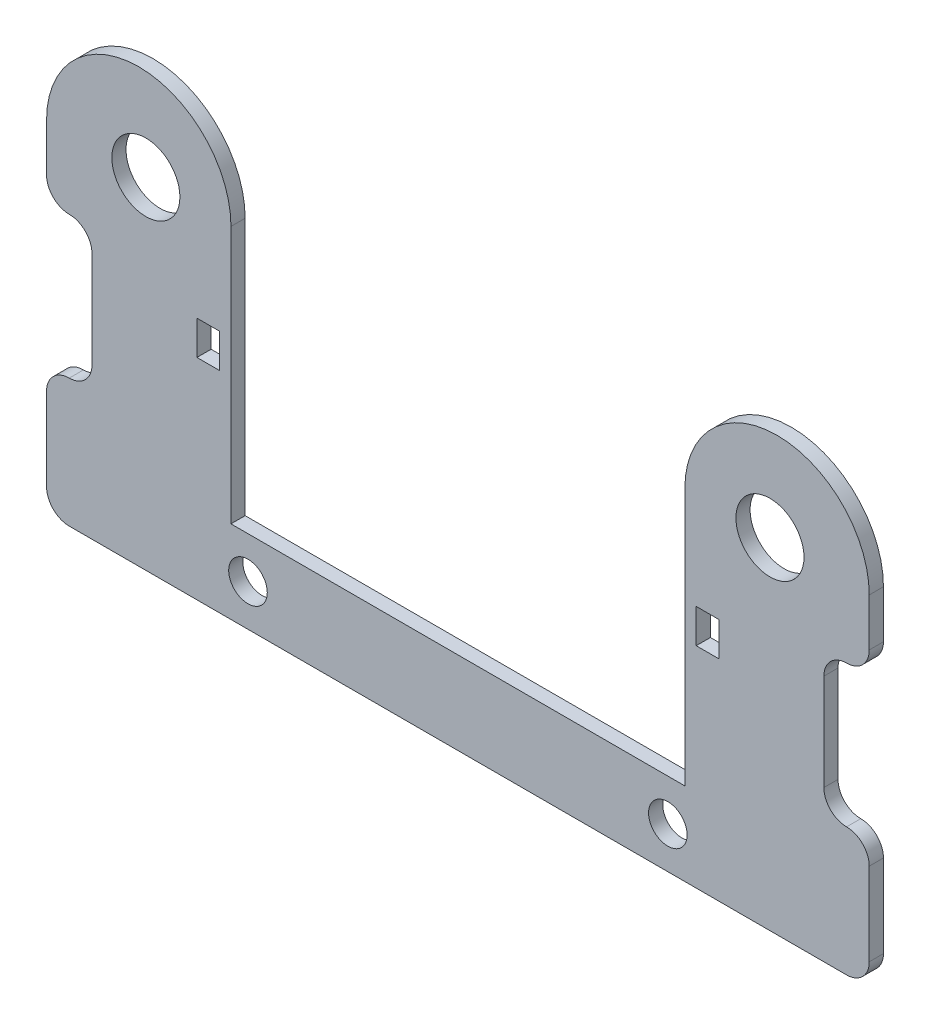
ISO-10303-21;
HEADER;
FILE_DESCRIPTION(('STEP AP214'),'2;1');
FILE_NAME('part.step','',(''),(''),'','','');
FILE_SCHEMA(('AUTOMOTIVE_DESIGN { 1 0 10303 214 1 1 1 1 }'));
ENDSEC;
DATA;
#1=APPLICATION_CONTEXT('core data for automotive mechanical design processes');
#2=APPLICATION_PROTOCOL_DEFINITION('international standard','automotive_design',2000,#1);
#3=PRODUCT_CONTEXT('',#1,'mechanical');
#4=PRODUCT('Part','Part','',(#3));
#5=PRODUCT_RELATED_PRODUCT_CATEGORY('part','',(#4));
#6=PRODUCT_DEFINITION_FORMATION('','',#4);
#7=PRODUCT_DEFINITION_CONTEXT('part definition',#1,'design');
#8=PRODUCT_DEFINITION('design','',#6,#7);
#9=PRODUCT_DEFINITION_SHAPE('','',#8);
#10=(LENGTH_UNIT() NAMED_UNIT(*) SI_UNIT(.MILLI.,.METRE.));
#11=(NAMED_UNIT(*) PLANE_ANGLE_UNIT() SI_UNIT($,.RADIAN.));
#12=(NAMED_UNIT(*) SI_UNIT($,.STERADIAN.) SOLID_ANGLE_UNIT());
#13=UNCERTAINTY_MEASURE_WITH_UNIT(LENGTH_MEASURE(1.E-05),#10,'distance_accuracy_value','');
#14=(GEOMETRIC_REPRESENTATION_CONTEXT(3) GLOBAL_UNCERTAINTY_ASSIGNED_CONTEXT((#13)) GLOBAL_UNIT_ASSIGNED_CONTEXT((#10,
#11,#12)) REPRESENTATION_CONTEXT('',''));
#15=CARTESIAN_POINT('',(0.,0.,0.));
#16=DIRECTION('',(0.,0.,1.));
#17=DIRECTION('',(1.,0.,0.));
#18=AXIS2_PLACEMENT_3D('',#15,#16,#17);
#19=CARTESIAN_POINT('',(92.075,38.1,1.5875));
#20=DIRECTION('',(-1.,0.,0.));
#21=DIRECTION('',(0.,-1.,0.));
#22=AXIS2_PLACEMENT_3D('',#19,#20,#21);
#23=PLANE('',#22);
#24=DIRECTION('',(0.,1.,0.));
#25=VECTOR('',#24,1.);
#26=CARTESIAN_POINT('',(92.075,38.1,0.));
#27=LINE('',#26,#25);
#28=CARTESIAN_POINT('',(92.075,2.54000000000003,0.));
#29=VERTEX_POINT('',#28);
#30=CARTESIAN_POINT('',(92.075,11.811,0.));
#31=VERTEX_POINT('',#30);
#32=EDGE_CURVE('E354',#29,#31,#27,.T.);
#33=ORIENTED_EDGE('',*,*,#32,.T.);
#34=DIRECTION('',(0.,0.,1.));
#35=VECTOR('',#34,1.);
#36=CARTESIAN_POINT('',(92.075,11.811,1.5875));
#37=LINE('',#36,#35);
#38=CARTESIAN_POINT('',(92.075,11.811,1.5875));
#39=VERTEX_POINT('',#38);
#40=EDGE_CURVE('E417',#31,#39,#37,.T.);
#41=ORIENTED_EDGE('',*,*,#40,.T.);
#42=DIRECTION('',(0.,1.,0.));
#43=VECTOR('',#42,1.);
#44=CARTESIAN_POINT('',(92.075,38.1,1.5875));
#45=LINE('',#44,#43);
#46=CARTESIAN_POINT('',(92.075,2.54000000000003,1.5875));
#47=VERTEX_POINT('',#46);
#48=EDGE_CURVE('E332',#47,#39,#45,.T.);
#49=ORIENTED_EDGE('',*,*,#48,.F.);
#50=DIRECTION('',(0.,0.,-1.));
#51=VECTOR('',#50,1.);
#52=CARTESIAN_POINT('',(92.075,2.54000000000001,1.5875));
#53=LINE('',#52,#51);
#54=EDGE_CURVE('E391',#47,#29,#53,.T.);
#55=ORIENTED_EDGE('',*,*,#54,.T.);
#56=EDGE_LOOP('',(#33,#41,#49,#55));
#57=FACE_BOUND('',#56,.T.);
#58=ADVANCED_FACE('F33',(#57),#23,.F.);
#59=CARTESIAN_POINT('',(0.,38.1,1.5875));
#60=DIRECTION('',(1.,0.,0.));
#61=DIRECTION('',(0.,1.,0.));
#62=AXIS2_PLACEMENT_3D('',#59,#60,#61);
#63=PLANE('',#62);
#64=DIRECTION('',(0.,-1.,0.));
#65=VECTOR('',#64,1.);
#66=CARTESIAN_POINT('',(0.,38.1,1.5875));
#67=LINE('',#66,#65);
#68=CARTESIAN_POINT('',(0.,11.811,1.5875));
#69=VERTEX_POINT('',#68);
#70=CARTESIAN_POINT('',(0.,2.54000000000001,1.5875));
#71=VERTEX_POINT('',#70);
#72=EDGE_CURVE('E346',#69,#71,#67,.T.);
#73=ORIENTED_EDGE('',*,*,#72,.F.);
#74=DIRECTION('',(0.,0.,1.));
#75=VECTOR('',#74,1.);
#76=CARTESIAN_POINT('',(0.,11.811,1.5875));
#77=LINE('',#76,#75);
#78=CARTESIAN_POINT('',(0.,11.811,0.));
#79=VERTEX_POINT('',#78);
#80=EDGE_CURVE('E441',#69,#79,#77,.F.);
#81=ORIENTED_EDGE('',*,*,#80,.T.);
#82=DIRECTION('',(0.,-1.,0.));
#83=VECTOR('',#82,1.);
#84=CARTESIAN_POINT('',(0.,38.1,0.));
#85=LINE('',#84,#83);
#86=CARTESIAN_POINT('',(0.,2.54000000000001,0.));
#87=VERTEX_POINT('',#86);
#88=EDGE_CURVE('E367',#79,#87,#85,.T.);
#89=ORIENTED_EDGE('',*,*,#88,.T.);
#90=DIRECTION('',(0.,0.,-1.));
#91=VECTOR('',#90,1.);
#92=CARTESIAN_POINT('',(0.,2.54,1.5875));
#93=LINE('',#92,#91);
#94=EDGE_CURVE('E408',#87,#71,#93,.F.);
#95=ORIENTED_EDGE('',*,*,#94,.T.);
#96=EDGE_LOOP('',(#73,#81,#89,#95));
#97=FACE_BOUND('',#96,.T.);
#98=ADVANCED_FACE('F552',(#97),#63,.F.);
#99=CARTESIAN_POINT('',(10.31875,38.1,1.5875));
#100=DIRECTION('',(0.,0.,-1.));
#101=DIRECTION('',(-1.,0.,0.));
#102=AXIS2_PLACEMENT_3D('',#99,#100,#101);
#103=PLANE('',#102);
#104=ORIENTED_EDGE('',*,*,#48,.T.);
#105=CARTESIAN_POINT('',(89.535,11.811,1.5875));
#106=DIRECTION('',(0.,0.,-1.));
#107=DIRECTION('',(-1.,0.,0.));
#108=AXIS2_PLACEMENT_3D('',#105,#106,#107);
#109=CIRCLE('',#108,2.54);
#110=CARTESIAN_POINT('',(89.535,14.351,1.5875));
#111=VERTEX_POINT('',#110);
#112=EDGE_CURVE('E425',#39,#111,#109,.F.);
#113=ORIENTED_EDGE('',*,*,#112,.T.);
#114=CARTESIAN_POINT('',(89.535,16.891,1.5875));
#115=DIRECTION('',(0.,0.,-1.));
#116=DIRECTION('',(-1.,0.,0.));
#117=AXIS2_PLACEMENT_3D('',#114,#115,#116);
#118=CIRCLE('',#117,2.54);
#119=CARTESIAN_POINT('',(86.995,16.891,1.5875));
#120=VERTEX_POINT('',#119);
#121=EDGE_CURVE('E449',#111,#120,#118,.T.);
#122=ORIENTED_EDGE('',*,*,#121,.T.);
#123=DIRECTION('',(0.,-1.,0.));
#124=VECTOR('',#123,1.);
#125=CARTESIAN_POINT('',(86.995,30.226,1.5875));
#126=LINE('',#125,#124);
#127=CARTESIAN_POINT('',(86.995,27.686,1.5875));
#128=VERTEX_POINT('',#127);
#129=EDGE_CURVE('E524',#128,#120,#126,.T.);
#130=ORIENTED_EDGE('',*,*,#129,.F.);
#131=CARTESIAN_POINT('',(89.535,27.686,1.5875));
#132=DIRECTION('',(0.,0.,-1.));
#133=DIRECTION('',(-1.,0.,0.));
#134=AXIS2_PLACEMENT_3D('',#131,#132,#133);
#135=CIRCLE('',#134,2.54);
#136=CARTESIAN_POINT('',(89.535,30.226,1.5875));
#137=VERTEX_POINT('',#136);
#138=EDGE_CURVE('E445',#128,#137,#135,.T.);
#139=ORIENTED_EDGE('',*,*,#138,.T.);
#140=CARTESIAN_POINT('',(89.535,32.766,1.5875));
#141=DIRECTION('',(0.,0.,-1.));
#142=DIRECTION('',(-1.,0.,0.));
#143=AXIS2_PLACEMENT_3D('',#140,#141,#142);
#144=CIRCLE('',#143,2.54);
#145=CARTESIAN_POINT('',(92.075,32.766,1.5875));
#146=VERTEX_POINT('',#145);
#147=EDGE_CURVE('E423',#137,#146,#144,.F.);
#148=ORIENTED_EDGE('',*,*,#147,.T.);
#149=CARTESIAN_POINT('',(92.075,38.1,1.5875));
#150=VERTEX_POINT('',#149);
#151=EDGE_CURVE('E336',#146,#150,#45,.T.);
#152=ORIENTED_EDGE('',*,*,#151,.T.);
#153=CARTESIAN_POINT('',(81.75625,38.1,1.5875));
#154=DIRECTION('',(0.,0.,1.));
#155=DIRECTION('',(-1.,0.,0.));
#156=AXIS2_PLACEMENT_3D('',#153,#154,#155);
#157=CIRCLE('',#156,10.31875);
#158=CARTESIAN_POINT('',(71.4375,38.1,1.5875));
#159=VERTEX_POINT('',#158);
#160=EDGE_CURVE('E335',#150,#159,#157,.T.);
#161=ORIENTED_EDGE('',*,*,#160,.T.);
#162=DIRECTION('',(0.,-1.,0.));
#163=VECTOR('',#162,1.);
#164=CARTESIAN_POINT('',(71.4375,9.27100000000001,1.5875));
#165=LINE('',#164,#163);
#166=CARTESIAN_POINT('',(71.4375,9.27100000000001,1.5875));
#167=VERTEX_POINT('',#166);
#168=EDGE_CURVE('E338',#159,#167,#165,.T.);
#169=ORIENTED_EDGE('',*,*,#168,.T.);
#170=DIRECTION('',(-1.,0.,0.));
#171=VECTOR('',#170,1.);
#172=CARTESIAN_POINT('',(20.6375,9.271,1.5875));
#173=LINE('',#172,#171);
#174=CARTESIAN_POINT('',(20.6375,9.271,1.5875));
#175=VERTEX_POINT('',#174);
#176=EDGE_CURVE('E340',#167,#175,#173,.T.);
#177=ORIENTED_EDGE('',*,*,#176,.T.);
#178=DIRECTION('',(0.,1.,0.));
#179=VECTOR('',#178,1.);
#180=CARTESIAN_POINT('',(20.6375,38.1,1.5875));
#181=LINE('',#180,#179);
#182=CARTESIAN_POINT('',(20.6375,38.1,1.5875));
#183=VERTEX_POINT('',#182);
#184=EDGE_CURVE('E342',#175,#183,#181,.T.);
#185=ORIENTED_EDGE('',*,*,#184,.T.);
#186=CARTESIAN_POINT('',(10.31875,38.1,1.5875));
#187=DIRECTION('',(0.,0.,1.));
#188=DIRECTION('',(-1.,0.,0.));
#189=AXIS2_PLACEMENT_3D('',#186,#187,#188);
#190=CIRCLE('',#189,10.31875);
#191=CARTESIAN_POINT('',(0.,38.1,1.5875));
#192=VERTEX_POINT('',#191);
#193=EDGE_CURVE('E344',#183,#192,#190,.T.);
#194=ORIENTED_EDGE('',*,*,#193,.T.);
#195=CARTESIAN_POINT('',(0.,32.766,1.5875));
#196=VERTEX_POINT('',#195);
#197=EDGE_CURVE('E347',#192,#196,#67,.T.);
#198=ORIENTED_EDGE('',*,*,#197,.T.);
#199=CARTESIAN_POINT('',(2.54,32.766,1.5875));
#200=DIRECTION('',(0.,0.,-1.));
#201=DIRECTION('',(-1.,0.,0.));
#202=AXIS2_PLACEMENT_3D('',#199,#200,#201);
#203=CIRCLE('',#202,2.54);
#204=CARTESIAN_POINT('',(2.54,30.226,1.5875));
#205=VERTEX_POINT('',#204);
#206=EDGE_CURVE('E419',#196,#205,#203,.F.);
#207=ORIENTED_EDGE('',*,*,#206,.T.);
#208=CARTESIAN_POINT('',(2.54,27.686,1.5875));
#209=DIRECTION('',(0.,0.,-1.));
#210=DIRECTION('',(-1.,0.,0.));
#211=AXIS2_PLACEMENT_3D('',#208,#209,#210);
#212=CIRCLE('',#211,2.54);
#213=CARTESIAN_POINT('',(5.08,27.686,1.5875));
#214=VERTEX_POINT('',#213);
#215=EDGE_CURVE('E42',#205,#214,#212,.T.);
#216=ORIENTED_EDGE('',*,*,#215,.T.);
#217=DIRECTION('',(0.,1.,0.));
#218=VECTOR('',#217,1.);
#219=CARTESIAN_POINT('',(5.08,30.226,1.5875));
#220=LINE('',#219,#218);
#221=CARTESIAN_POINT('',(5.08,16.891,1.5875));
#222=VERTEX_POINT('',#221);
#223=EDGE_CURVE('E272',#222,#214,#220,.T.);
#224=ORIENTED_EDGE('',*,*,#223,.F.);
#225=CARTESIAN_POINT('',(2.54,16.891,1.5875));
#226=DIRECTION('',(0.,0.,-1.));
#227=DIRECTION('',(-1.,0.,0.));
#228=AXIS2_PLACEMENT_3D('',#225,#226,#227);
#229=CIRCLE('',#228,2.54);
#230=CARTESIAN_POINT('',(2.54,14.351,1.5875));
#231=VERTEX_POINT('',#230);
#232=EDGE_CURVE('E453',#222,#231,#229,.T.);
#233=ORIENTED_EDGE('',*,*,#232,.T.);
#234=CARTESIAN_POINT('',(2.54,11.811,1.5875));
#235=DIRECTION('',(0.,0.,-1.));
#236=DIRECTION('',(-1.,0.,0.));
#237=AXIS2_PLACEMENT_3D('',#234,#235,#236);
#238=CIRCLE('',#237,2.54);
#239=EDGE_CURVE('E421',#231,#69,#238,.F.);
#240=ORIENTED_EDGE('',*,*,#239,.T.);
#241=ORIENTED_EDGE('',*,*,#72,.T.);
#242=CARTESIAN_POINT('',(2.54,2.54,1.5875));
#243=DIRECTION('',(0.,0.,-1.));
#244=DIRECTION('',(-1.,0.,0.));
#245=AXIS2_PLACEMENT_3D('',#242,#243,#244);
#246=CIRCLE('',#245,2.54);
#247=CARTESIAN_POINT('',(2.54,0.,1.5875));
#248=VERTEX_POINT('',#247);
#249=EDGE_CURVE('E404',#71,#248,#246,.F.);
#250=ORIENTED_EDGE('',*,*,#249,.T.);
#251=DIRECTION('',(1.,0.,0.));
#252=VECTOR('',#251,1.);
#253=CARTESIAN_POINT('',(0.,0.,1.5875));
#254=LINE('',#253,#252);
#255=CARTESIAN_POINT('',(89.535,0.,1.5875));
#256=VERTEX_POINT('',#255);
#257=EDGE_CURVE('E350',#248,#256,#254,.T.);
#258=ORIENTED_EDGE('',*,*,#257,.T.);
#259=CARTESIAN_POINT('',(89.535,2.54000000000001,1.5875));
#260=DIRECTION('',(0.,0.,-1.));
#261=DIRECTION('',(-1.,0.,0.));
#262=AXIS2_PLACEMENT_3D('',#259,#260,#261);
#263=CIRCLE('',#262,2.54);
#264=EDGE_CURVE('E406',#256,#47,#263,.F.);
#265=ORIENTED_EDGE('',*,*,#264,.T.);
#266=EDGE_LOOP('',(#104,#113,#122,#130,#139,#148,#152,#161,#169,#177,#185,#194,#198,#207,#216,
#224,#233,#240,#241,#250,#258,#265));
#267=FACE_BOUND('',#266,.T.);
#268=DIRECTION('',(0.,1.,0.));
#269=VECTOR('',#268,1.);
#270=CARTESIAN_POINT('',(19.3675,27.305,1.5875));
#271=LINE('',#270,#269);
#272=CARTESIAN_POINT('',(19.3675,23.495,1.5875));
#273=VERTEX_POINT('',#272);
#274=CARTESIAN_POINT('',(19.3675,27.305,1.5875));
#275=VERTEX_POINT('',#274);
#276=EDGE_CURVE('E257',#273,#275,#271,.T.);
#277=ORIENTED_EDGE('',*,*,#276,.F.);
#278=DIRECTION('',(1.,0.,0.));
#279=VECTOR('',#278,1.);
#280=CARTESIAN_POINT('',(16.8275,23.495,1.5875));
#281=LINE('',#280,#279);
#282=CARTESIAN_POINT('',(16.8275,23.495,1.5875));
#283=VERTEX_POINT('',#282);
#284=EDGE_CURVE('E249',#283,#273,#281,.T.);
#285=ORIENTED_EDGE('',*,*,#284,.F.);
#286=DIRECTION('',(0.,-1.,0.));
#287=VECTOR('',#286,1.);
#288=CARTESIAN_POINT('',(16.8275,27.305,1.5875));
#289=LINE('',#288,#287);
#290=CARTESIAN_POINT('',(16.8275,27.305,1.5875));
#291=VERTEX_POINT('',#290);
#292=EDGE_CURVE('E261',#291,#283,#289,.T.);
#293=ORIENTED_EDGE('',*,*,#292,.F.);
#294=DIRECTION('',(-1.,0.,0.));
#295=VECTOR('',#294,1.);
#296=CARTESIAN_POINT('',(16.8275,27.305,1.5875));
#297=LINE('',#296,#295);
#298=EDGE_CURVE('E255',#275,#291,#297,.T.);
#299=ORIENTED_EDGE('',*,*,#298,.F.);
#300=EDGE_LOOP('',(#277,#285,#293,#299));
#301=FACE_BOUND('',#300,.T.);
#302=DIRECTION('',(0.,1.,0.));
#303=VECTOR('',#302,1.);
#304=CARTESIAN_POINT('',(75.2475,27.305,1.5875));
#305=LINE('',#304,#303);
#306=CARTESIAN_POINT('',(75.2475,23.495,1.5875));
#307=VERTEX_POINT('',#306);
#308=CARTESIAN_POINT('',(75.2475,27.305,1.5875));
#309=VERTEX_POINT('',#308);
#310=EDGE_CURVE('E276',#307,#309,#305,.T.);
#311=ORIENTED_EDGE('',*,*,#310,.F.);
#312=DIRECTION('',(1.,0.,0.));
#313=VECTOR('',#312,1.);
#314=CARTESIAN_POINT('',(72.7075,23.495,1.5875));
#315=LINE('',#314,#313);
#316=CARTESIAN_POINT('',(72.7075,23.495,1.5875));
#317=VERTEX_POINT('',#316);
#318=EDGE_CURVE('E279',#317,#307,#315,.T.);
#319=ORIENTED_EDGE('',*,*,#318,.F.);
#320=DIRECTION('',(0.,-1.,0.));
#321=VECTOR('',#320,1.);
#322=CARTESIAN_POINT('',(72.7075,27.305,1.5875));
#323=LINE('',#322,#321);
#324=CARTESIAN_POINT('',(72.7075,27.305,1.5875));
#325=VERTEX_POINT('',#324);
#326=EDGE_CURVE('E282',#325,#317,#323,.T.);
#327=ORIENTED_EDGE('',*,*,#326,.F.);
#328=DIRECTION('',(-1.,0.,0.));
#329=VECTOR('',#328,1.);
#330=CARTESIAN_POINT('',(72.7075,27.305,1.5875));
#331=LINE('',#330,#329);
#332=EDGE_CURVE('E273',#309,#325,#331,.T.);
#333=ORIENTED_EDGE('',*,*,#332,.F.);
#334=EDGE_LOOP('',(#311,#319,#327,#333));
#335=FACE_BOUND('',#334,.T.);
#336=CARTESIAN_POINT('',(22.5425,4.63549999999999,1.5875));
#337=DIRECTION('',(0.,0.,1.));
#338=DIRECTION('',(1.,0.,0.));
#339=AXIS2_PLACEMENT_3D('',#336,#337,#338);
#340=CIRCLE('',#339,2.159);
#341=CARTESIAN_POINT('',(24.7015,4.63549999999999,1.5875));
#342=VERTEX_POINT('',#341);
#343=EDGE_CURVE('E326',#342,#342,#340,.T.);
#344=ORIENTED_EDGE('',*,*,#343,.F.);
#345=EDGE_LOOP('',(#344));
#346=FACE_BOUND('',#345,.T.);
#347=CARTESIAN_POINT('',(69.5325,4.63550000000001,1.5875));
#348=DIRECTION('',(0.,0.,1.));
#349=DIRECTION('',(1.,0.,0.));
#350=AXIS2_PLACEMENT_3D('',#347,#348,#349);
#351=CIRCLE('',#350,2.15899999999998);
#352=CARTESIAN_POINT('',(71.6915,4.63550000000001,1.5875));
#353=VERTEX_POINT('',#352);
#354=EDGE_CURVE('E320',#353,#353,#351,.T.);
#355=ORIENTED_EDGE('',*,*,#354,.F.);
#356=EDGE_LOOP('',(#355));
#357=FACE_BOUND('',#356,.T.);
#358=CARTESIAN_POINT('',(11.1125,38.1,1.5875));
#359=DIRECTION('',(0.,0.,1.));
#360=DIRECTION('',(1.,0.,0.));
#361=AXIS2_PLACEMENT_3D('',#358,#359,#360);
#362=CIRCLE('',#361,3.81);
#363=CARTESIAN_POINT('',(14.9225,38.1,1.5875));
#364=VERTEX_POINT('',#363);
#365=EDGE_CURVE('E314',#364,#364,#362,.T.);
#366=ORIENTED_EDGE('',*,*,#365,.F.);
#367=EDGE_LOOP('',(#366));
#368=FACE_BOUND('',#367,.T.);
#369=CARTESIAN_POINT('',(80.9625,38.1,1.5875));
#370=DIRECTION('',(0.,0.,1.));
#371=DIRECTION('',(1.,0.,0.));
#372=AXIS2_PLACEMENT_3D('',#369,#370,#371);
#373=CIRCLE('',#372,3.81);
#374=CARTESIAN_POINT('',(84.7725,38.1,1.5875));
#375=VERTEX_POINT('',#374);
#376=EDGE_CURVE('E306',#375,#375,#373,.T.);
#377=ORIENTED_EDGE('',*,*,#376,.F.);
#378=EDGE_LOOP('',(#377));
#379=FACE_BOUND('',#378,.T.);
#380=ADVANCED_FACE('F539',(#267,#301,#335,#346,#357,#368,#379),#103,.F.);
#381=CARTESIAN_POINT('',(10.31875,38.1,0.));
#382=DIRECTION('',(0.,0.,-1.));
#383=DIRECTION('',(-1.,0.,0.));
#384=AXIS2_PLACEMENT_3D('',#381,#382,#383);
#385=PLANE('',#384);
#386=DIRECTION('',(0.,-1.,0.));
#387=VECTOR('',#386,1.);
#388=CARTESIAN_POINT('',(86.995,30.226,0.));
#389=LINE('',#388,#387);
#390=CARTESIAN_POINT('',(86.995,27.686,0.));
#391=VERTEX_POINT('',#390);
#392=CARTESIAN_POINT('',(86.995,16.891,0.));
#393=VERTEX_POINT('',#392);
#394=EDGE_CURVE('E313',#391,#393,#389,.T.);
#395=ORIENTED_EDGE('',*,*,#394,.T.);
#396=CARTESIAN_POINT('',(89.535,16.891,0.));
#397=DIRECTION('',(0.,0.,-1.));
#398=DIRECTION('',(-1.,0.,0.));
#399=AXIS2_PLACEMENT_3D('',#396,#397,#398);
#400=CIRCLE('',#399,2.54);
#401=CARTESIAN_POINT('',(89.535,14.351,0.));
#402=VERTEX_POINT('',#401);
#403=EDGE_CURVE('E451',#393,#402,#400,.F.);
#404=ORIENTED_EDGE('',*,*,#403,.T.);
#405=CARTESIAN_POINT('',(89.535,11.811,0.));
#406=DIRECTION('',(0.,0.,-1.));
#407=DIRECTION('',(-1.,0.,0.));
#408=AXIS2_PLACEMENT_3D('',#405,#406,#407);
#409=CIRCLE('',#408,2.54);
#410=EDGE_CURVE('E432',#402,#31,#409,.T.);
#411=ORIENTED_EDGE('',*,*,#410,.T.);
#412=ORIENTED_EDGE('',*,*,#32,.F.);
#413=CARTESIAN_POINT('',(89.535,2.54000000000001,0.));
#414=DIRECTION('',(0.,0.,-1.));
#415=DIRECTION('',(-1.,0.,0.));
#416=AXIS2_PLACEMENT_3D('',#413,#414,#415);
#417=CIRCLE('',#416,2.54);
#418=CARTESIAN_POINT('',(89.535,0.,0.));
#419=VERTEX_POINT('',#418);
#420=EDGE_CURVE('E397',#29,#419,#417,.T.);
#421=ORIENTED_EDGE('',*,*,#420,.T.);
#422=DIRECTION('',(1.,0.,0.));
#423=VECTOR('',#422,1.);
#424=CARTESIAN_POINT('',(0.,0.,0.));
#425=LINE('',#424,#423);
#426=CARTESIAN_POINT('',(2.54,0.,0.));
#427=VERTEX_POINT('',#426);
#428=EDGE_CURVE('E371',#427,#419,#425,.T.);
#429=ORIENTED_EDGE('',*,*,#428,.F.);
#430=CARTESIAN_POINT('',(2.54,2.54,0.));
#431=DIRECTION('',(0.,0.,-1.));
#432=DIRECTION('',(-1.,0.,0.));
#433=AXIS2_PLACEMENT_3D('',#430,#431,#432);
#434=CIRCLE('',#433,2.54);
#435=EDGE_CURVE('E394',#427,#87,#434,.T.);
#436=ORIENTED_EDGE('',*,*,#435,.T.);
#437=ORIENTED_EDGE('',*,*,#88,.F.);
#438=CARTESIAN_POINT('',(2.54,11.811,0.));
#439=DIRECTION('',(0.,0.,-1.));
#440=DIRECTION('',(-1.,0.,0.));
#441=AXIS2_PLACEMENT_3D('',#438,#439,#440);
#442=CIRCLE('',#441,2.54);
#443=CARTESIAN_POINT('',(2.54,14.351,0.));
#444=VERTEX_POINT('',#443);
#445=EDGE_CURVE('E429',#79,#444,#442,.T.);
#446=ORIENTED_EDGE('',*,*,#445,.T.);
#447=CARTESIAN_POINT('',(2.54,16.891,0.));
#448=DIRECTION('',(0.,0.,-1.));
#449=DIRECTION('',(-1.,0.,0.));
#450=AXIS2_PLACEMENT_3D('',#447,#448,#449);
#451=CIRCLE('',#450,2.54);
#452=CARTESIAN_POINT('',(5.08,16.891,0.));
#453=VERTEX_POINT('',#452);
#454=EDGE_CURVE('E455',#444,#453,#451,.F.);
#455=ORIENTED_EDGE('',*,*,#454,.T.);
#456=DIRECTION('',(0.,1.,0.));
#457=VECTOR('',#456,1.);
#458=CARTESIAN_POINT('',(5.08,30.226,0.));
#459=LINE('',#458,#457);
#460=CARTESIAN_POINT('',(5.08,27.686,0.));
#461=VERTEX_POINT('',#460);
#462=EDGE_CURVE('E526',#453,#461,#459,.T.);
#463=ORIENTED_EDGE('',*,*,#462,.T.);
#464=CARTESIAN_POINT('',(2.54,27.686,0.));
#465=DIRECTION('',(0.,0.,-1.));
#466=DIRECTION('',(-1.,0.,0.));
#467=AXIS2_PLACEMENT_3D('',#464,#465,#466);
#468=CIRCLE('',#467,2.54);
#469=CARTESIAN_POINT('',(2.54,30.226,0.));
#470=VERTEX_POINT('',#469);
#471=EDGE_CURVE('E11',#461,#470,#468,.F.);
#472=ORIENTED_EDGE('',*,*,#471,.T.);
#473=CARTESIAN_POINT('',(2.54,32.766,0.));
#474=DIRECTION('',(0.,0.,-1.));
#475=DIRECTION('',(-1.,0.,0.));
#476=AXIS2_PLACEMENT_3D('',#473,#474,#475);
#477=CIRCLE('',#476,2.54);
#478=CARTESIAN_POINT('',(0.,32.766,0.));
#479=VERTEX_POINT('',#478);
#480=EDGE_CURVE('E427',#470,#479,#477,.T.);
#481=ORIENTED_EDGE('',*,*,#480,.T.);
#482=CARTESIAN_POINT('',(0.,38.1,0.));
#483=VERTEX_POINT('',#482);
#484=EDGE_CURVE('E368',#483,#479,#85,.T.);
#485=ORIENTED_EDGE('',*,*,#484,.F.);
#486=CARTESIAN_POINT('',(10.31875,38.1,0.));
#487=DIRECTION('',(0.,0.,1.));
#488=DIRECTION('',(-1.,0.,0.));
#489=AXIS2_PLACEMENT_3D('',#486,#487,#488);
#490=CIRCLE('',#489,10.31875);
#491=CARTESIAN_POINT('',(20.6375,38.1,0.));
#492=VERTEX_POINT('',#491);
#493=EDGE_CURVE('E365',#492,#483,#490,.T.);
#494=ORIENTED_EDGE('',*,*,#493,.F.);
#495=DIRECTION('',(0.,1.,0.));
#496=VECTOR('',#495,1.);
#497=CARTESIAN_POINT('',(20.6375,38.1,0.));
#498=LINE('',#497,#496);
#499=CARTESIAN_POINT('',(20.6375,9.271,0.));
#500=VERTEX_POINT('',#499);
#501=EDGE_CURVE('E363',#500,#492,#498,.T.);
#502=ORIENTED_EDGE('',*,*,#501,.F.);
#503=DIRECTION('',(-1.,0.,0.));
#504=VECTOR('',#503,1.);
#505=CARTESIAN_POINT('',(20.6375,9.271,0.));
#506=LINE('',#505,#504);
#507=CARTESIAN_POINT('',(71.4375,9.27100000000001,0.));
#508=VERTEX_POINT('',#507);
#509=EDGE_CURVE('E361',#508,#500,#506,.T.);
#510=ORIENTED_EDGE('',*,*,#509,.F.);
#511=DIRECTION('',(0.,-1.,0.));
#512=VECTOR('',#511,1.);
#513=CARTESIAN_POINT('',(71.4375,9.27100000000001,0.));
#514=LINE('',#513,#512);
#515=CARTESIAN_POINT('',(71.4375,38.1,0.));
#516=VERTEX_POINT('',#515);
#517=EDGE_CURVE('E359',#516,#508,#514,.T.);
#518=ORIENTED_EDGE('',*,*,#517,.F.);
#519=CARTESIAN_POINT('',(81.75625,38.1,0.));
#520=DIRECTION('',(0.,0.,1.));
#521=DIRECTION('',(-1.,0.,0.));
#522=AXIS2_PLACEMENT_3D('',#519,#520,#521);
#523=CIRCLE('',#522,10.31875);
#524=CARTESIAN_POINT('',(92.075,38.1,0.));
#525=VERTEX_POINT('',#524);
#526=EDGE_CURVE('E357',#525,#516,#523,.T.);
#527=ORIENTED_EDGE('',*,*,#526,.F.);
#528=CARTESIAN_POINT('',(92.075,32.766,0.));
#529=VERTEX_POINT('',#528);
#530=EDGE_CURVE('E329',#529,#525,#27,.T.);
#531=ORIENTED_EDGE('',*,*,#530,.F.);
#532=CARTESIAN_POINT('',(89.535,32.766,0.));
#533=DIRECTION('',(0.,0.,-1.));
#534=DIRECTION('',(-1.,0.,0.));
#535=AXIS2_PLACEMENT_3D('',#532,#533,#534);
#536=CIRCLE('',#535,2.54);
#537=CARTESIAN_POINT('',(89.535,30.226,0.));
#538=VERTEX_POINT('',#537);
#539=EDGE_CURVE('E50',#529,#538,#536,.T.);
#540=ORIENTED_EDGE('',*,*,#539,.T.);
#541=CARTESIAN_POINT('',(89.535,27.686,0.));
#542=DIRECTION('',(0.,0.,-1.));
#543=DIRECTION('',(-1.,0.,0.));
#544=AXIS2_PLACEMENT_3D('',#541,#542,#543);
#545=CIRCLE('',#544,2.54);
#546=EDGE_CURVE('E447',#538,#391,#545,.F.);
#547=ORIENTED_EDGE('',*,*,#546,.T.);
#548=EDGE_LOOP('',(#395,#404,#411,#412,#421,#429,#436,#437,#446,#455,#463,#472,#481,#485,#494,
#502,#510,#518,#527,#531,#540,#547));
#549=FACE_BOUND('',#548,.T.);
#550=DIRECTION('',(1.,0.,0.));
#551=VECTOR('',#550,1.);
#552=CARTESIAN_POINT('',(16.8275,23.495,0.));
#553=LINE('',#552,#551);
#554=CARTESIAN_POINT('',(16.8275,23.495,0.));
#555=VERTEX_POINT('',#554);
#556=CARTESIAN_POINT('',(19.3675,23.495,0.));
#557=VERTEX_POINT('',#556);
#558=EDGE_CURVE('E246',#555,#557,#553,.T.);
#559=ORIENTED_EDGE('',*,*,#558,.T.);
#560=DIRECTION('',(0.,1.,0.));
#561=VECTOR('',#560,1.);
#562=CARTESIAN_POINT('',(19.3675,27.305,0.));
#563=LINE('',#562,#561);
#564=CARTESIAN_POINT('',(19.3675,27.305,0.));
#565=VERTEX_POINT('',#564);
#566=EDGE_CURVE('E232',#557,#565,#563,.T.);
#567=ORIENTED_EDGE('',*,*,#566,.T.);
#568=DIRECTION('',(-1.,0.,0.));
#569=VECTOR('',#568,1.);
#570=CARTESIAN_POINT('',(16.8275,27.305,0.));
#571=LINE('',#570,#569);
#572=CARTESIAN_POINT('',(16.8275,27.305,0.));
#573=VERTEX_POINT('',#572);
#574=EDGE_CURVE('E266',#565,#573,#571,.T.);
#575=ORIENTED_EDGE('',*,*,#574,.T.);
#576=DIRECTION('',(0.,-1.,0.));
#577=VECTOR('',#576,1.);
#578=CARTESIAN_POINT('',(16.8275,27.305,0.));
#579=LINE('',#578,#577);
#580=EDGE_CURVE('E254',#573,#555,#579,.T.);
#581=ORIENTED_EDGE('',*,*,#580,.T.);
#582=EDGE_LOOP('',(#559,#567,#575,#581));
#583=FACE_BOUND('',#582,.T.);
#584=DIRECTION('',(1.,0.,0.));
#585=VECTOR('',#584,1.);
#586=CARTESIAN_POINT('',(72.7075,23.495,0.));
#587=LINE('',#586,#585);
#588=CARTESIAN_POINT('',(72.7075,23.495,0.));
#589=VERTEX_POINT('',#588);
#590=CARTESIAN_POINT('',(75.2475,23.495,0.));
#591=VERTEX_POINT('',#590);
#592=EDGE_CURVE('E275',#589,#591,#587,.T.);
#593=ORIENTED_EDGE('',*,*,#592,.T.);
#594=DIRECTION('',(0.,1.,0.));
#595=VECTOR('',#594,1.);
#596=CARTESIAN_POINT('',(75.2475,27.305,0.));
#597=LINE('',#596,#595);
#598=CARTESIAN_POINT('',(75.2475,27.305,0.));
#599=VERTEX_POINT('',#598);
#600=EDGE_CURVE('E298',#591,#599,#597,.T.);
#601=ORIENTED_EDGE('',*,*,#600,.T.);
#602=DIRECTION('',(-1.,0.,0.));
#603=VECTOR('',#602,1.);
#604=CARTESIAN_POINT('',(72.7075,27.305,0.));
#605=LINE('',#604,#603);
#606=CARTESIAN_POINT('',(72.7075,27.305,0.));
#607=VERTEX_POINT('',#606);
#608=EDGE_CURVE('E294',#599,#607,#605,.T.);
#609=ORIENTED_EDGE('',*,*,#608,.T.);
#610=DIRECTION('',(0.,-1.,0.));
#611=VECTOR('',#610,1.);
#612=CARTESIAN_POINT('',(72.7075,27.305,0.));
#613=LINE('',#612,#611);
#614=EDGE_CURVE('E289',#607,#589,#613,.T.);
#615=ORIENTED_EDGE('',*,*,#614,.T.);
#616=EDGE_LOOP('',(#593,#601,#609,#615));
#617=FACE_BOUND('',#616,.T.);
#618=CARTESIAN_POINT('',(11.1125,38.1,0.));
#619=DIRECTION('',(0.,0.,1.));
#620=DIRECTION('',(1.,0.,0.));
#621=AXIS2_PLACEMENT_3D('',#618,#619,#620);
#622=CIRCLE('',#621,3.81);
#623=CARTESIAN_POINT('',(14.9225,38.1,0.));
#624=VERTEX_POINT('',#623);
#625=EDGE_CURVE('E309',#624,#624,#622,.T.);
#626=ORIENTED_EDGE('',*,*,#625,.T.);
#627=EDGE_LOOP('',(#626));
#628=FACE_BOUND('',#627,.T.);
#629=CARTESIAN_POINT('',(22.5425,4.63549999999999,0.));
#630=DIRECTION('',(0.,0.,1.));
#631=DIRECTION('',(1.,0.,0.));
#632=AXIS2_PLACEMENT_3D('',#629,#630,#631);
#633=CIRCLE('',#632,2.159);
#634=CARTESIAN_POINT('',(24.7015,4.63549999999999,0.));
#635=VERTEX_POINT('',#634);
#636=EDGE_CURVE('E323',#635,#635,#633,.T.);
#637=ORIENTED_EDGE('',*,*,#636,.T.);
#638=EDGE_LOOP('',(#637));
#639=FACE_BOUND('',#638,.T.);
#640=CARTESIAN_POINT('',(69.5325,4.63550000000001,0.));
#641=DIRECTION('',(0.,0.,1.));
#642=DIRECTION('',(1.,0.,0.));
#643=AXIS2_PLACEMENT_3D('',#640,#641,#642);
#644=CIRCLE('',#643,2.15899999999998);
#645=CARTESIAN_POINT('',(71.6915,4.63550000000001,0.));
#646=VERTEX_POINT('',#645);
#647=EDGE_CURVE('E317',#646,#646,#644,.T.);
#648=ORIENTED_EDGE('',*,*,#647,.T.);
#649=EDGE_LOOP('',(#648));
#650=FACE_BOUND('',#649,.T.);
#651=CARTESIAN_POINT('',(80.9625,38.1,0.));
#652=DIRECTION('',(0.,0.,1.));
#653=DIRECTION('',(1.,0.,0.));
#654=AXIS2_PLACEMENT_3D('',#651,#652,#653);
#655=CIRCLE('',#654,3.81);
#656=CARTESIAN_POINT('',(84.7725,38.1,0.));
#657=VERTEX_POINT('',#656);
#658=EDGE_CURVE('E310',#657,#657,#655,.T.);
#659=ORIENTED_EDGE('',*,*,#658,.T.);
#660=EDGE_LOOP('',(#659));
#661=FACE_BOUND('',#660,.T.);
#662=ADVANCED_FACE('F252',(#549,#583,#617,#628,#639,#650,#661),#385,.T.);
#663=ORIENTED_EDGE('',*,*,#151,.F.);
#664=DIRECTION('',(0.,0.,1.));
#665=VECTOR('',#664,1.);
#666=CARTESIAN_POINT('',(92.075,32.766,1.5875));
#667=LINE('',#666,#665);
#668=EDGE_CURVE('E58',#146,#529,#667,.F.);
#669=ORIENTED_EDGE('',*,*,#668,.T.);
#670=ORIENTED_EDGE('',*,*,#530,.T.);
#671=DIRECTION('',(0.,0.,-1.));
#672=VECTOR('',#671,1.);
#673=CARTESIAN_POINT('',(92.075,38.1,1.5875));
#674=LINE('',#673,#672);
#675=EDGE_CURVE('E388',#150,#525,#674,.T.);
#676=ORIENTED_EDGE('',*,*,#675,.F.);
#677=EDGE_LOOP('',(#663,#669,#670,#676));
#678=FACE_BOUND('',#677,.T.);
#679=ADVANCED_FACE('F509',(#678),#23,.F.);
#680=CARTESIAN_POINT('',(81.75625,38.1,1.5875));
#681=DIRECTION('',(0.,0.,-1.));
#682=DIRECTION('',(-1.,0.,0.));
#683=AXIS2_PLACEMENT_3D('',#680,#681,#682);
#684=CYLINDRICAL_SURFACE('',#683,10.31875);
#685=ORIENTED_EDGE('',*,*,#526,.T.);
#686=DIRECTION('',(0.,0.,-1.));
#687=VECTOR('',#686,1.);
#688=CARTESIAN_POINT('',(71.4375,38.1,1.5875));
#689=LINE('',#688,#687);
#690=EDGE_CURVE('E385',#159,#516,#689,.T.);
#691=ORIENTED_EDGE('',*,*,#690,.F.);
#692=ORIENTED_EDGE('',*,*,#160,.F.);
#693=ORIENTED_EDGE('',*,*,#675,.T.);
#694=EDGE_LOOP('',(#685,#691,#692,#693));
#695=FACE_BOUND('',#694,.T.);
#696=ADVANCED_FACE('F508',(#695),#684,.T.);
#697=CARTESIAN_POINT('',(71.4375,9.27100000000001,1.5875));
#698=DIRECTION('',(1.,0.,0.));
#699=DIRECTION('',(0.,0.,-1.));
#700=AXIS2_PLACEMENT_3D('',#697,#698,#699);
#701=PLANE('',#700);
#702=ORIENTED_EDGE('',*,*,#517,.T.);
#703=DIRECTION('',(0.,0.,-1.));
#704=VECTOR('',#703,1.);
#705=CARTESIAN_POINT('',(71.4375,9.27100000000001,1.5875));
#706=LINE('',#705,#704);
#707=EDGE_CURVE('E382',#167,#508,#706,.T.);
#708=ORIENTED_EDGE('',*,*,#707,.F.);
#709=ORIENTED_EDGE('',*,*,#168,.F.);
#710=ORIENTED_EDGE('',*,*,#690,.T.);
#711=EDGE_LOOP('',(#702,#708,#709,#710));
#712=FACE_BOUND('',#711,.T.);
#713=ADVANCED_FACE('F502',(#712),#701,.F.);
#714=CARTESIAN_POINT('',(20.6375,9.271,1.5875));
#715=DIRECTION('',(0.,-1.,0.));
#716=DIRECTION('',(1.,0.,0.));
#717=AXIS2_PLACEMENT_3D('',#714,#715,#716);
#718=PLANE('',#717);
#719=ORIENTED_EDGE('',*,*,#509,.T.);
#720=DIRECTION('',(0.,0.,-1.));
#721=VECTOR('',#720,1.);
#722=CARTESIAN_POINT('',(20.6375,9.271,1.5875));
#723=LINE('',#722,#721);
#724=EDGE_CURVE('E379',#175,#500,#723,.T.);
#725=ORIENTED_EDGE('',*,*,#724,.F.);
#726=ORIENTED_EDGE('',*,*,#176,.F.);
#727=ORIENTED_EDGE('',*,*,#707,.T.);
#728=EDGE_LOOP('',(#719,#725,#726,#727));
#729=FACE_BOUND('',#728,.T.);
#730=ADVANCED_FACE('F498',(#729),#718,.F.);
#731=CARTESIAN_POINT('',(20.6375,38.1,1.5875));
#732=DIRECTION('',(-1.,0.,0.));
#733=DIRECTION('',(0.,-1.,0.));
#734=AXIS2_PLACEMENT_3D('',#731,#732,#733);
#735=PLANE('',#734);
#736=ORIENTED_EDGE('',*,*,#501,.T.);
#737=DIRECTION('',(0.,0.,-1.));
#738=VECTOR('',#737,1.);
#739=CARTESIAN_POINT('',(20.6375,38.1,1.5875));
#740=LINE('',#739,#738);
#741=EDGE_CURVE('E376',#183,#492,#740,.T.);
#742=ORIENTED_EDGE('',*,*,#741,.F.);
#743=ORIENTED_EDGE('',*,*,#184,.F.);
#744=ORIENTED_EDGE('',*,*,#724,.T.);
#745=EDGE_LOOP('',(#736,#742,#743,#744));
#746=FACE_BOUND('',#745,.T.);
#747=ADVANCED_FACE('F493',(#746),#735,.F.);
#748=CARTESIAN_POINT('',(10.31875,38.1,1.5875));
#749=DIRECTION('',(0.,0.,-1.));
#750=DIRECTION('',(-1.,0.,0.));
#751=AXIS2_PLACEMENT_3D('',#748,#749,#750);
#752=CYLINDRICAL_SURFACE('',#751,10.31875);
#753=ORIENTED_EDGE('',*,*,#493,.T.);
#754=DIRECTION('',(0.,0.,-1.));
#755=VECTOR('',#754,1.);
#756=CARTESIAN_POINT('',(0.,38.1,1.5875));
#757=LINE('',#756,#755);
#758=EDGE_CURVE('E353',#192,#483,#757,.T.);
#759=ORIENTED_EDGE('',*,*,#758,.F.);
#760=ORIENTED_EDGE('',*,*,#193,.F.);
#761=ORIENTED_EDGE('',*,*,#741,.T.);
#762=EDGE_LOOP('',(#753,#759,#760,#761));
#763=FACE_BOUND('',#762,.T.);
#764=ADVANCED_FACE('F487',(#763),#752,.T.);
#765=ORIENTED_EDGE('',*,*,#484,.T.);
#766=DIRECTION('',(0.,0.,1.));
#767=VECTOR('',#766,1.);
#768=CARTESIAN_POINT('',(0.,32.766,1.5875));
#769=LINE('',#768,#767);
#770=EDGE_CURVE('E443',#479,#196,#769,.T.);
#771=ORIENTED_EDGE('',*,*,#770,.T.);
#772=ORIENTED_EDGE('',*,*,#197,.F.);
#773=ORIENTED_EDGE('',*,*,#758,.T.);
#774=EDGE_LOOP('',(#765,#771,#772,#773));
#775=FACE_BOUND('',#774,.T.);
#776=ADVANCED_FACE('F482',(#775),#63,.F.);
#777=CARTESIAN_POINT('',(0.,0.,1.5875));
#778=DIRECTION('',(0.,1.,0.));
#779=DIRECTION('',(-1.,0.,0.));
#780=AXIS2_PLACEMENT_3D('',#777,#778,#779);
#781=PLANE('',#780);
#782=ORIENTED_EDGE('',*,*,#428,.T.);
#783=DIRECTION('',(0.,0.,-1.));
#784=VECTOR('',#783,1.);
#785=CARTESIAN_POINT('',(89.535,0.,1.5875));
#786=LINE('',#785,#784);
#787=EDGE_CURVE('E402',#419,#256,#786,.F.);
#788=ORIENTED_EDGE('',*,*,#787,.T.);
#789=ORIENTED_EDGE('',*,*,#257,.F.);
#790=DIRECTION('',(0.,0.,-1.));
#791=VECTOR('',#790,1.);
#792=CARTESIAN_POINT('',(2.54,0.,1.5875));
#793=LINE('',#792,#791);
#794=EDGE_CURVE('E399',#248,#427,#793,.T.);
#795=ORIENTED_EDGE('',*,*,#794,.T.);
#796=EDGE_LOOP('',(#782,#788,#789,#795));
#797=FACE_BOUND('',#796,.T.);
#798=ADVANCED_FACE('F576',(#797),#781,.F.);
#799=CARTESIAN_POINT('',(22.5425,4.63549999999999,1.5875));
#800=DIRECTION('',(0.,0.,-1.));
#801=DIRECTION('',(-1.,0.,0.));
#802=AXIS2_PLACEMENT_3D('',#799,#800,#801);
#803=CYLINDRICAL_SURFACE('',#802,2.159);
#804=ORIENTED_EDGE('',*,*,#343,.T.);
#805=EDGE_LOOP('',(#804));
#806=FACE_BOUND('',#805,.T.);
#807=ORIENTED_EDGE('',*,*,#636,.F.);
#808=EDGE_LOOP('',(#807));
#809=FACE_BOUND('',#808,.T.);
#810=ADVANCED_FACE('F578',(#806,#809),#803,.F.);
#811=CARTESIAN_POINT('',(69.5325,4.63550000000001,1.5875));
#812=DIRECTION('',(0.,0.,-1.));
#813=DIRECTION('',(-1.,0.,0.));
#814=AXIS2_PLACEMENT_3D('',#811,#812,#813);
#815=CYLINDRICAL_SURFACE('',#814,2.15899999999998);
#816=ORIENTED_EDGE('',*,*,#354,.T.);
#817=EDGE_LOOP('',(#816));
#818=FACE_BOUND('',#817,.T.);
#819=ORIENTED_EDGE('',*,*,#647,.F.);
#820=EDGE_LOOP('',(#819));
#821=FACE_BOUND('',#820,.T.);
#822=ADVANCED_FACE('F623',(#818,#821),#815,.F.);
#823=CARTESIAN_POINT('',(11.1125,38.1,1.5875));
#824=DIRECTION('',(0.,0.,-1.));
#825=DIRECTION('',(-1.,0.,0.));
#826=AXIS2_PLACEMENT_3D('',#823,#824,#825);
#827=CYLINDRICAL_SURFACE('',#826,3.81);
#828=ORIENTED_EDGE('',*,*,#365,.T.);
#829=EDGE_LOOP('',(#828));
#830=FACE_BOUND('',#829,.T.);
#831=ORIENTED_EDGE('',*,*,#625,.F.);
#832=EDGE_LOOP('',(#831));
#833=FACE_BOUND('',#832,.T.);
#834=ADVANCED_FACE('F630',(#830,#833),#827,.F.);
#835=CARTESIAN_POINT('',(80.9625,38.1,1.5875));
#836=DIRECTION('',(0.,0.,-1.));
#837=DIRECTION('',(-1.,0.,0.));
#838=AXIS2_PLACEMENT_3D('',#835,#836,#837);
#839=CYLINDRICAL_SURFACE('',#838,3.81);
#840=ORIENTED_EDGE('',*,*,#376,.T.);
#841=EDGE_LOOP('',(#840));
#842=FACE_BOUND('',#841,.T.);
#843=ORIENTED_EDGE('',*,*,#658,.F.);
#844=EDGE_LOOP('',(#843));
#845=FACE_BOUND('',#844,.T.);
#846=ADVANCED_FACE('F638',(#842,#845),#839,.F.);
#847=CARTESIAN_POINT('',(89.535,2.54000000000001,1.5875));
#848=DIRECTION('',(0.,0.,-1.));
#849=DIRECTION('',(-1.,0.,0.));
#850=AXIS2_PLACEMENT_3D('',#847,#848,#849);
#851=CYLINDRICAL_SURFACE('',#850,2.54);
#852=ORIENTED_EDGE('',*,*,#264,.F.);
#853=ORIENTED_EDGE('',*,*,#787,.F.);
#854=ORIENTED_EDGE('',*,*,#420,.F.);
#855=ORIENTED_EDGE('',*,*,#54,.F.);
#856=EDGE_LOOP('',(#852,#853,#854,#855));
#857=FACE_BOUND('',#856,.T.);
#858=ADVANCED_FACE('F645',(#857),#851,.T.);
#859=CARTESIAN_POINT('',(2.54,2.54,1.5875));
#860=DIRECTION('',(0.,0.,-1.));
#861=DIRECTION('',(-1.,0.,0.));
#862=AXIS2_PLACEMENT_3D('',#859,#860,#861);
#863=CYLINDRICAL_SURFACE('',#862,2.54);
#864=ORIENTED_EDGE('',*,*,#249,.F.);
#865=ORIENTED_EDGE('',*,*,#94,.F.);
#866=ORIENTED_EDGE('',*,*,#435,.F.);
#867=ORIENTED_EDGE('',*,*,#794,.F.);
#868=EDGE_LOOP('',(#864,#865,#866,#867));
#869=FACE_BOUND('',#868,.T.);
#870=ADVANCED_FACE('F652',(#869),#863,.T.);
#871=CARTESIAN_POINT('',(5.08,30.226,-16.6679940304765));
#872=DIRECTION('',(1.,0.,0.));
#873=DIRECTION('',(0.,0.,-1.));
#874=AXIS2_PLACEMENT_3D('',#871,#872,#873);
#875=PLANE('',#874);
#876=ORIENTED_EDGE('',*,*,#462,.F.);
#877=DIRECTION('',(0.,0.,1.));
#878=VECTOR('',#877,1.);
#879=CARTESIAN_POINT('',(5.08,16.891,1.5875));
#880=LINE('',#879,#878);
#881=EDGE_CURVE('E438',#453,#222,#880,.T.);
#882=ORIENTED_EDGE('',*,*,#881,.T.);
#883=ORIENTED_EDGE('',*,*,#223,.T.);
#884=DIRECTION('',(0.,0.,1.));
#885=VECTOR('',#884,1.);
#886=CARTESIAN_POINT('',(5.08,27.686,0.));
#887=LINE('',#886,#885);
#888=EDGE_CURVE('E435',#214,#461,#887,.F.);
#889=ORIENTED_EDGE('',*,*,#888,.T.);
#890=EDGE_LOOP('',(#876,#882,#883,#889));
#891=FACE_BOUND('',#890,.T.);
#892=ADVANCED_FACE('F659',(#891),#875,.F.);
#893=CARTESIAN_POINT('',(86.995,30.226,-16.6679940304765));
#894=DIRECTION('',(-1.,0.,0.));
#895=DIRECTION('',(0.,0.,1.));
#896=AXIS2_PLACEMENT_3D('',#893,#894,#895);
#897=PLANE('',#896);
#898=ORIENTED_EDGE('',*,*,#394,.F.);
#899=DIRECTION('',(0.,0.,1.));
#900=VECTOR('',#899,1.);
#901=CARTESIAN_POINT('',(86.995,27.686,1.5875));
#902=LINE('',#901,#900);
#903=EDGE_CURVE('E414',#391,#128,#902,.T.);
#904=ORIENTED_EDGE('',*,*,#903,.T.);
#905=ORIENTED_EDGE('',*,*,#129,.T.);
#906=DIRECTION('',(0.,0.,1.));
#907=VECTOR('',#906,1.);
#908=CARTESIAN_POINT('',(86.995,16.891,0.));
#909=LINE('',#908,#907);
#910=EDGE_CURVE('E411',#120,#393,#909,.F.);
#911=ORIENTED_EDGE('',*,*,#910,.T.);
#912=EDGE_LOOP('',(#898,#904,#905,#911));
#913=FACE_BOUND('',#912,.T.);
#914=ADVANCED_FACE('F520',(#913),#897,.F.);
#915=CARTESIAN_POINT('',(72.7075,23.495,-16.6679940304765));
#916=DIRECTION('',(0.,-1.,0.));
#917=DIRECTION('',(1.,0.,0.));
#918=AXIS2_PLACEMENT_3D('',#915,#916,#917);
#919=PLANE('',#918);
#920=DIRECTION('',(0.,0.,1.));
#921=VECTOR('',#920,1.);
#922=CARTESIAN_POINT('',(72.7075,23.495,-16.6679940304765));
#923=LINE('',#922,#921);
#924=EDGE_CURVE('E292',#589,#317,#923,.T.);
#925=ORIENTED_EDGE('',*,*,#924,.T.);
#926=ORIENTED_EDGE('',*,*,#318,.T.);
#927=DIRECTION('',(0.,0.,1.));
#928=VECTOR('',#927,1.);
#929=CARTESIAN_POINT('',(75.2475,23.495,-16.6679940304765));
#930=LINE('',#929,#928);
#931=EDGE_CURVE('E288',#591,#307,#930,.T.);
#932=ORIENTED_EDGE('',*,*,#931,.F.);
#933=ORIENTED_EDGE('',*,*,#592,.F.);
#934=EDGE_LOOP('',(#925,#926,#932,#933));
#935=FACE_BOUND('',#934,.T.);
#936=ADVANCED_FACE('F678',(#935),#919,.F.);
#937=CARTESIAN_POINT('',(75.2475,27.305,-16.6679940304765));
#938=DIRECTION('',(1.,0.,0.));
#939=DIRECTION('',(0.,0.,-1.));
#940=AXIS2_PLACEMENT_3D('',#937,#938,#939);
#941=PLANE('',#940);
#942=ORIENTED_EDGE('',*,*,#931,.T.);
#943=ORIENTED_EDGE('',*,*,#310,.T.);
#944=DIRECTION('',(0.,0.,1.));
#945=VECTOR('',#944,1.);
#946=CARTESIAN_POINT('',(75.2475,27.305,-16.6679940304765));
#947=LINE('',#946,#945);
#948=EDGE_CURVE('E297',#599,#309,#947,.T.);
#949=ORIENTED_EDGE('',*,*,#948,.F.);
#950=ORIENTED_EDGE('',*,*,#600,.F.);
#951=EDGE_LOOP('',(#942,#943,#949,#950));
#952=FACE_BOUND('',#951,.T.);
#953=ADVANCED_FACE('F687',(#952),#941,.F.);
#954=CARTESIAN_POINT('',(72.7075,27.305,-16.6679940304765));
#955=DIRECTION('',(0.,1.,0.));
#956=DIRECTION('',(-1.,0.,0.));
#957=AXIS2_PLACEMENT_3D('',#954,#955,#956);
#958=PLANE('',#957);
#959=ORIENTED_EDGE('',*,*,#948,.T.);
#960=ORIENTED_EDGE('',*,*,#332,.T.);
#961=DIRECTION('',(0.,0.,1.));
#962=VECTOR('',#961,1.);
#963=CARTESIAN_POINT('',(72.7075,27.305,-16.6679940304765));
#964=LINE('',#963,#962);
#965=EDGE_CURVE('E293',#607,#325,#964,.T.);
#966=ORIENTED_EDGE('',*,*,#965,.F.);
#967=ORIENTED_EDGE('',*,*,#608,.F.);
#968=EDGE_LOOP('',(#959,#960,#966,#967));
#969=FACE_BOUND('',#968,.T.);
#970=ADVANCED_FACE('F694',(#969),#958,.F.);
#971=CARTESIAN_POINT('',(72.7075,27.305,-16.6679940304765));
#972=DIRECTION('',(-1.,0.,0.));
#973=DIRECTION('',(0.,0.,1.));
#974=AXIS2_PLACEMENT_3D('',#971,#972,#973);
#975=PLANE('',#974);
#976=ORIENTED_EDGE('',*,*,#965,.T.);
#977=ORIENTED_EDGE('',*,*,#326,.T.);
#978=ORIENTED_EDGE('',*,*,#924,.F.);
#979=ORIENTED_EDGE('',*,*,#614,.F.);
#980=EDGE_LOOP('',(#976,#977,#978,#979));
#981=FACE_BOUND('',#980,.T.);
#982=ADVANCED_FACE('F702',(#981),#975,.F.);
#983=CARTESIAN_POINT('',(16.8275,23.495,-16.6679940304765));
#984=DIRECTION('',(0.,-1.,0.));
#985=DIRECTION('',(1.,0.,0.));
#986=AXIS2_PLACEMENT_3D('',#983,#984,#985);
#987=PLANE('',#986);
#988=DIRECTION('',(0.,0.,1.));
#989=VECTOR('',#988,1.);
#990=CARTESIAN_POINT('',(16.8275,23.495,-16.6679940304765));
#991=LINE('',#990,#989);
#992=EDGE_CURVE('E264',#555,#283,#991,.T.);
#993=ORIENTED_EDGE('',*,*,#992,.T.);
#994=ORIENTED_EDGE('',*,*,#284,.T.);
#995=DIRECTION('',(0.,0.,1.));
#996=VECTOR('',#995,1.);
#997=CARTESIAN_POINT('',(19.3675,23.495,-16.6679940304765));
#998=LINE('',#997,#996);
#999=EDGE_CURVE('E236',#557,#273,#998,.T.);
#1000=ORIENTED_EDGE('',*,*,#999,.F.);
#1001=ORIENTED_EDGE('',*,*,#558,.F.);
#1002=EDGE_LOOP('',(#993,#994,#1000,#1001));
#1003=FACE_BOUND('',#1002,.T.);
#1004=ADVANCED_FACE('F245',(#1003),#987,.F.);
#1005=CARTESIAN_POINT('',(19.3675,27.305,-16.6679940304765));
#1006=DIRECTION('',(1.,0.,0.));
#1007=DIRECTION('',(0.,0.,-1.));
#1008=AXIS2_PLACEMENT_3D('',#1005,#1006,#1007);
#1009=PLANE('',#1008);
#1010=ORIENTED_EDGE('',*,*,#999,.T.);
#1011=ORIENTED_EDGE('',*,*,#276,.T.);
#1012=DIRECTION('',(0.,0.,1.));
#1013=VECTOR('',#1012,1.);
#1014=CARTESIAN_POINT('',(19.3675,27.305,-16.6679940304765));
#1015=LINE('',#1014,#1013);
#1016=EDGE_CURVE('E238',#565,#275,#1015,.T.);
#1017=ORIENTED_EDGE('',*,*,#1016,.F.);
#1018=ORIENTED_EDGE('',*,*,#566,.F.);
#1019=EDGE_LOOP('',(#1010,#1011,#1017,#1018));
#1020=FACE_BOUND('',#1019,.T.);
#1021=ADVANCED_FACE('F234',(#1020),#1009,.F.);
#1022=CARTESIAN_POINT('',(16.8275,27.305,-16.6679940304765));
#1023=DIRECTION('',(0.,1.,0.));
#1024=DIRECTION('',(-1.,0.,0.));
#1025=AXIS2_PLACEMENT_3D('',#1022,#1023,#1024);
#1026=PLANE('',#1025);
#1027=ORIENTED_EDGE('',*,*,#1016,.T.);
#1028=ORIENTED_EDGE('',*,*,#298,.T.);
#1029=DIRECTION('',(0.,0.,1.));
#1030=VECTOR('',#1029,1.);
#1031=CARTESIAN_POINT('',(16.8275,27.305,-16.6679940304765));
#1032=LINE('',#1031,#1030);
#1033=EDGE_CURVE('E265',#573,#291,#1032,.T.);
#1034=ORIENTED_EDGE('',*,*,#1033,.F.);
#1035=ORIENTED_EDGE('',*,*,#574,.F.);
#1036=EDGE_LOOP('',(#1027,#1028,#1034,#1035));
#1037=FACE_BOUND('',#1036,.T.);
#1038=ADVANCED_FACE('F542',(#1037),#1026,.F.);
#1039=CARTESIAN_POINT('',(16.8275,27.305,-16.6679940304765));
#1040=DIRECTION('',(-1.,0.,0.));
#1041=DIRECTION('',(0.,0.,1.));
#1042=AXIS2_PLACEMENT_3D('',#1039,#1040,#1041);
#1043=PLANE('',#1042);
#1044=ORIENTED_EDGE('',*,*,#1033,.T.);
#1045=ORIENTED_EDGE('',*,*,#292,.T.);
#1046=ORIENTED_EDGE('',*,*,#992,.F.);
#1047=ORIENTED_EDGE('',*,*,#580,.F.);
#1048=EDGE_LOOP('',(#1044,#1045,#1046,#1047));
#1049=FACE_BOUND('',#1048,.T.);
#1050=ADVANCED_FACE('F535',(#1049),#1043,.F.);
#1051=CARTESIAN_POINT('',(89.535,32.766,-16.6679940304765));
#1052=DIRECTION('',(0.,0.,1.));
#1053=DIRECTION('',(1.,0.,0.));
#1054=AXIS2_PLACEMENT_3D('',#1051,#1052,#1053);
#1055=CYLINDRICAL_SURFACE('',#1054,2.54);
#1056=DIRECTION('',(0.,0.,1.));
#1057=VECTOR('',#1056,1.);
#1058=CARTESIAN_POINT('',(89.535,30.226,-16.6679940304765));
#1059=LINE('',#1058,#1057);
#1060=EDGE_CURVE('E285',#538,#137,#1059,.T.);
#1061=ORIENTED_EDGE('',*,*,#1060,.F.);
#1062=ORIENTED_EDGE('',*,*,#539,.F.);
#1063=ORIENTED_EDGE('',*,*,#668,.F.);
#1064=ORIENTED_EDGE('',*,*,#147,.F.);
#1065=EDGE_LOOP('',(#1061,#1062,#1063,#1064));
#1066=FACE_BOUND('',#1065,.T.);
#1067=ADVANCED_FACE('F513',(#1066),#1055,.T.);
#1068=CARTESIAN_POINT('',(89.535,27.686,-16.6679940304765));
#1069=DIRECTION('',(0.,0.,-1.));
#1070=DIRECTION('',(-1.,0.,0.));
#1071=AXIS2_PLACEMENT_3D('',#1068,#1069,#1070);
#1072=CYLINDRICAL_SURFACE('',#1071,2.54);
#1073=ORIENTED_EDGE('',*,*,#546,.F.);
#1074=ORIENTED_EDGE('',*,*,#1060,.T.);
#1075=ORIENTED_EDGE('',*,*,#138,.F.);
#1076=ORIENTED_EDGE('',*,*,#903,.F.);
#1077=EDGE_LOOP('',(#1073,#1074,#1075,#1076));
#1078=FACE_BOUND('',#1077,.T.);
#1079=ADVANCED_FACE('F517',(#1078),#1072,.F.);
#1080=CARTESIAN_POINT('',(89.535,11.811,1.5875));
#1081=DIRECTION('',(0.,0.,1.));
#1082=DIRECTION('',(1.,0.,0.));
#1083=AXIS2_PLACEMENT_3D('',#1080,#1081,#1082);
#1084=CYLINDRICAL_SURFACE('',#1083,2.54);
#1085=ORIENTED_EDGE('',*,*,#40,.F.);
#1086=ORIENTED_EDGE('',*,*,#410,.F.);
#1087=DIRECTION('',(0.,0.,1.));
#1088=VECTOR('',#1087,1.);
#1089=CARTESIAN_POINT('',(89.535,14.351,-16.6679940304765));
#1090=LINE('',#1089,#1088);
#1091=EDGE_CURVE('E460',#111,#402,#1090,.F.);
#1092=ORIENTED_EDGE('',*,*,#1091,.F.);
#1093=ORIENTED_EDGE('',*,*,#112,.F.);
#1094=EDGE_LOOP('',(#1085,#1086,#1092,#1093));
#1095=FACE_BOUND('',#1094,.T.);
#1096=ADVANCED_FACE('F743',(#1095),#1084,.T.);
#1097=CARTESIAN_POINT('',(89.535,16.891,-16.6679940304765));
#1098=DIRECTION('',(0.,0.,-1.));
#1099=DIRECTION('',(-1.,0.,0.));
#1100=AXIS2_PLACEMENT_3D('',#1097,#1098,#1099);
#1101=CYLINDRICAL_SURFACE('',#1100,2.54);
#1102=ORIENTED_EDGE('',*,*,#403,.F.);
#1103=ORIENTED_EDGE('',*,*,#910,.F.);
#1104=ORIENTED_EDGE('',*,*,#121,.F.);
#1105=ORIENTED_EDGE('',*,*,#1091,.T.);
#1106=EDGE_LOOP('',(#1102,#1103,#1104,#1105));
#1107=FACE_BOUND('',#1106,.T.);
#1108=ADVANCED_FACE('F750',(#1107),#1101,.F.);
#1109=CARTESIAN_POINT('',(2.54,11.811,-16.6679940304765));
#1110=DIRECTION('',(0.,0.,1.));
#1111=DIRECTION('',(1.,0.,0.));
#1112=AXIS2_PLACEMENT_3D('',#1109,#1110,#1111);
#1113=CYLINDRICAL_SURFACE('',#1112,2.54);
#1114=DIRECTION('',(0.,0.,1.));
#1115=VECTOR('',#1114,1.);
#1116=CARTESIAN_POINT('',(2.54,14.351,-16.6679940304765));
#1117=LINE('',#1116,#1115);
#1118=EDGE_CURVE('E462',#444,#231,#1117,.T.);
#1119=ORIENTED_EDGE('',*,*,#1118,.F.);
#1120=ORIENTED_EDGE('',*,*,#445,.F.);
#1121=ORIENTED_EDGE('',*,*,#80,.F.);
#1122=ORIENTED_EDGE('',*,*,#239,.F.);
#1123=EDGE_LOOP('',(#1119,#1120,#1121,#1122));
#1124=FACE_BOUND('',#1123,.T.);
#1125=ADVANCED_FACE('F758',(#1124),#1113,.T.);
#1126=CARTESIAN_POINT('',(2.54,16.891,-16.6679940304765));
#1127=DIRECTION('',(0.,0.,-1.));
#1128=DIRECTION('',(-1.,0.,0.));
#1129=AXIS2_PLACEMENT_3D('',#1126,#1127,#1128);
#1130=CYLINDRICAL_SURFACE('',#1129,2.54);
#1131=ORIENTED_EDGE('',*,*,#454,.F.);
#1132=ORIENTED_EDGE('',*,*,#1118,.T.);
#1133=ORIENTED_EDGE('',*,*,#232,.F.);
#1134=ORIENTED_EDGE('',*,*,#881,.F.);
#1135=EDGE_LOOP('',(#1131,#1132,#1133,#1134));
#1136=FACE_BOUND('',#1135,.T.);
#1137=ADVANCED_FACE('F766',(#1136),#1130,.F.);
#1138=CARTESIAN_POINT('',(2.54,32.766,1.5875));
#1139=DIRECTION('',(0.,0.,1.));
#1140=DIRECTION('',(1.,0.,0.));
#1141=AXIS2_PLACEMENT_3D('',#1138,#1139,#1140);
#1142=CYLINDRICAL_SURFACE('',#1141,2.54);
#1143=ORIENTED_EDGE('',*,*,#770,.F.);
#1144=ORIENTED_EDGE('',*,*,#480,.F.);
#1145=DIRECTION('',(0.,0.,1.));
#1146=VECTOR('',#1145,1.);
#1147=CARTESIAN_POINT('',(2.54,30.226,-16.6679940304765));
#1148=LINE('',#1147,#1146);
#1149=EDGE_CURVE('E37',#205,#470,#1148,.F.);
#1150=ORIENTED_EDGE('',*,*,#1149,.F.);
#1151=ORIENTED_EDGE('',*,*,#206,.F.);
#1152=EDGE_LOOP('',(#1143,#1144,#1150,#1151));
#1153=FACE_BOUND('',#1152,.T.);
#1154=ADVANCED_FACE('F35',(#1153),#1142,.T.);
#1155=CARTESIAN_POINT('',(2.54,27.686,-16.6679940304765));
#1156=DIRECTION('',(0.,0.,-1.));
#1157=DIRECTION('',(-1.,0.,0.));
#1158=AXIS2_PLACEMENT_3D('',#1155,#1156,#1157);
#1159=CYLINDRICAL_SURFACE('',#1158,2.54);
#1160=ORIENTED_EDGE('',*,*,#471,.F.);
#1161=ORIENTED_EDGE('',*,*,#888,.F.);
#1162=ORIENTED_EDGE('',*,*,#215,.F.);
#1163=ORIENTED_EDGE('',*,*,#1149,.T.);
#1164=EDGE_LOOP('',(#1160,#1161,#1162,#1163));
#1165=FACE_BOUND('',#1164,.T.);
#1166=ADVANCED_FACE('F471',(#1165),#1159,.F.);
#1167=CLOSED_SHELL('',(#58,#98,#380,#662,#679,#696,#713,#730,#747,#764,#776,#798,#810,#822,#834,
#846,#858,#870,#892,#914,#936,#953,#970,#982,#1004,#1021,#1038,#1050,#1067,#1079,#1096,#1108,
#1125,#1137,#1154,#1166));
#1168=MANIFOLD_SOLID_BREP('B2',#1167);
#1169=ADVANCED_BREP_SHAPE_REPRESENTATION('',(#18,#1168),#14);
#1170=SHAPE_DEFINITION_REPRESENTATION(#9,#1169);
ENDSEC;
END-ISO-10303-21;
